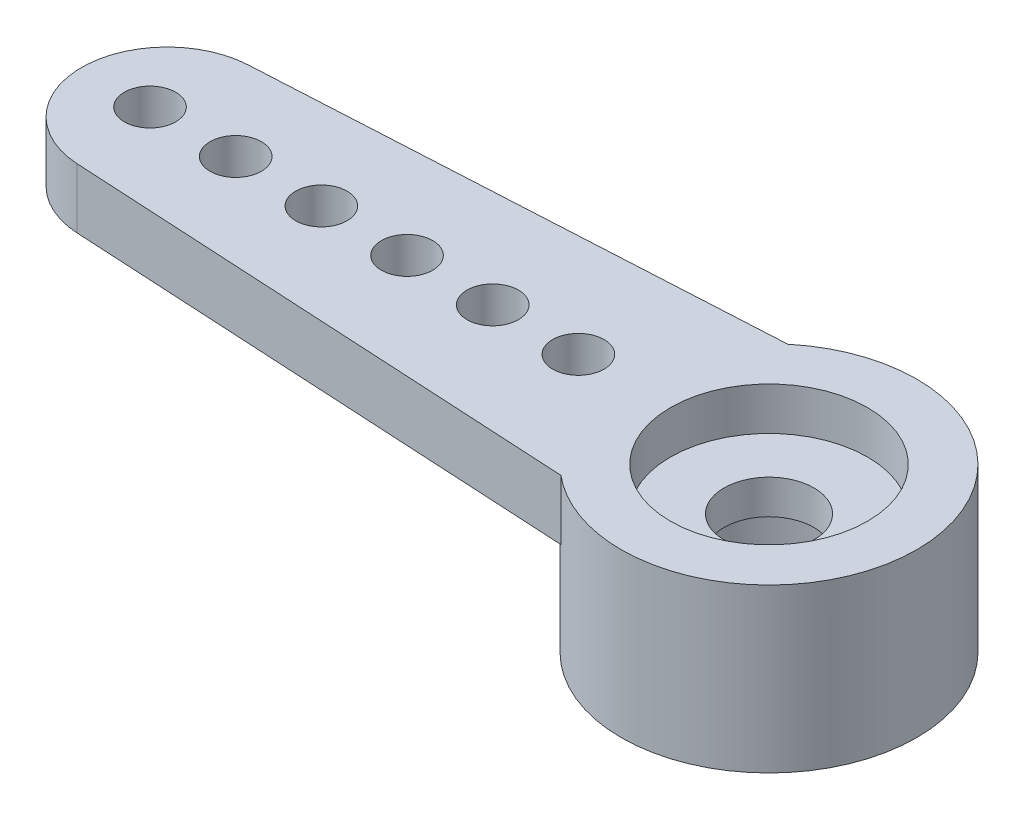
ISO-10303-21;
HEADER;
FILE_DESCRIPTION(('STEP AP214'),'2;1');
FILE_NAME('part.step','',(''),(''),'','','');
FILE_SCHEMA(('AUTOMOTIVE_DESIGN { 1 0 10303 214 1 1 1 1 }'));
ENDSEC;
DATA;
#1=APPLICATION_CONTEXT('core data for automotive mechanical design processes');
#2=APPLICATION_PROTOCOL_DEFINITION('international standard','automotive_design',2000,#1);
#3=PRODUCT_CONTEXT('',#1,'mechanical');
#4=PRODUCT('Part','Part','',(#3));
#5=PRODUCT_RELATED_PRODUCT_CATEGORY('part','',(#4));
#6=PRODUCT_DEFINITION_FORMATION('','',#4);
#7=PRODUCT_DEFINITION_CONTEXT('part definition',#1,'design');
#8=PRODUCT_DEFINITION('design','',#6,#7);
#9=PRODUCT_DEFINITION_SHAPE('','',#8);
#10=(LENGTH_UNIT() NAMED_UNIT(*) SI_UNIT(.MILLI.,.METRE.));
#11=(NAMED_UNIT(*) PLANE_ANGLE_UNIT() SI_UNIT($,.RADIAN.));
#12=(NAMED_UNIT(*) SI_UNIT($,.STERADIAN.) SOLID_ANGLE_UNIT());
#13=UNCERTAINTY_MEASURE_WITH_UNIT(LENGTH_MEASURE(1.E-05),#10,'distance_accuracy_value','');
#14=(GEOMETRIC_REPRESENTATION_CONTEXT(3) GLOBAL_UNCERTAINTY_ASSIGNED_CONTEXT((#13)) GLOBAL_UNIT_ASSIGNED_CONTEXT((#10,
#11,#12)) REPRESENTATION_CONTEXT('',''));
#15=CARTESIAN_POINT('',(0.,0.,0.));
#16=DIRECTION('',(0.,0.,1.));
#17=DIRECTION('',(1.,0.,0.));
#18=AXIS2_PLACEMENT_3D('',#15,#16,#17);
#19=CARTESIAN_POINT('',(0.,-1.4,0.));
#20=DIRECTION('',(0.,1.,0.));
#21=DIRECTION('',(0.,0.,1.));
#22=AXIS2_PLACEMENT_3D('',#19,#20,#21);
#23=PLANE('',#22);
#24=CARTESIAN_POINT('',(-12.45,-1.4,0.));
#25=DIRECTION('',(0.,1.,0.));
#26=DIRECTION('',(0.,0.,1.));
#27=AXIS2_PLACEMENT_3D('',#24,#25,#26);
#28=CIRCLE('',#27,0.600000000000014);
#29=CARTESIAN_POINT('',(-12.45,-1.4,0.600000000000014));
#30=VERTEX_POINT('',#29);
#31=EDGE_CURVE('E256',#30,#30,#28,.T.);
#32=ORIENTED_EDGE('',*,*,#31,.T.);
#33=EDGE_LOOP('',(#32));
#34=FACE_BOUND('',#33,.T.);
#35=CARTESIAN_POINT('',(-14.45,-1.4,0.));
#36=DIRECTION('',(0.,1.,0.));
#37=DIRECTION('',(0.,0.,1.));
#38=AXIS2_PLACEMENT_3D('',#35,#36,#37);
#39=CIRCLE('',#38,0.600000000000014);
#40=CARTESIAN_POINT('',(-14.45,-1.4,0.600000000000014));
#41=VERTEX_POINT('',#40);
#42=EDGE_CURVE('E101',#41,#41,#39,.T.);
#43=ORIENTED_EDGE('',*,*,#42,.T.);
#44=EDGE_LOOP('',(#43));
#45=FACE_BOUND('',#44,.T.);
#46=CARTESIAN_POINT('',(0.,-1.4,0.));
#47=DIRECTION('',(0.,-1.,0.));
#48=DIRECTION('',(0.,0.,-1.));
#49=AXIS2_PLACEMENT_3D('',#46,#47,#48);
#50=CIRCLE('',#49,3.45);
#51=CARTESIAN_POINT('',(-2.20907220343745,-1.4,2.65));
#52=VERTEX_POINT('',#51);
#53=CARTESIAN_POINT('',(-2.20907220343745,-1.4,-2.65));
#54=VERTEX_POINT('',#53);
#55=EDGE_CURVE('E88',#52,#54,#50,.T.);
#56=ORIENTED_EDGE('',*,*,#55,.F.);
#57=DIRECTION('',(0.998510440144325,0.,0.0545609835210727));
#58=VECTOR('',#57,1.);
#59=CARTESIAN_POINT('',(-2.20907220343745,-1.4,2.65));
#60=LINE('',#59,#58);
#61=CARTESIAN_POINT('',(-14.1591219670421,-1.4,1.99702088028865));
#62=VERTEX_POINT('',#61);
#63=EDGE_CURVE('E96',#62,#52,#60,.T.);
#64=ORIENTED_EDGE('',*,*,#63,.F.);
#65=CARTESIAN_POINT('',(-14.05,-1.4,0.));
#66=DIRECTION('',(0.,1.,0.));
#67=DIRECTION('',(0.,0.,1.));
#68=AXIS2_PLACEMENT_3D('',#65,#66,#67);
#69=CIRCLE('',#68,2.);
#70=CARTESIAN_POINT('',(-14.1591219670421,-1.4,-1.99702088028865));
#71=VERTEX_POINT('',#70);
#72=EDGE_CURVE('E114',#71,#62,#69,.T.);
#73=ORIENTED_EDGE('',*,*,#72,.F.);
#74=DIRECTION('',(-0.998510440144325,0.,0.0545609835210729));
#75=VECTOR('',#74,1.);
#76=CARTESIAN_POINT('',(-14.1591219670421,-1.4,-1.99702088028865));
#77=LINE('',#76,#75);
#78=EDGE_CURVE('E98',#54,#71,#77,.T.);
#79=ORIENTED_EDGE('',*,*,#78,.F.);
#80=EDGE_LOOP('',(#56,#64,#73,#79));
#81=FACE_BOUND('',#80,.T.);
#82=CARTESIAN_POINT('',(-10.45,-1.4,0.));
#83=DIRECTION('',(0.,1.,0.));
#84=DIRECTION('',(0.,0.,1.));
#85=AXIS2_PLACEMENT_3D('',#82,#83,#84);
#86=CIRCLE('',#85,0.600000000000014);
#87=CARTESIAN_POINT('',(-10.45,-1.4,0.600000000000014));
#88=VERTEX_POINT('',#87);
#89=EDGE_CURVE('E142',#88,#88,#86,.T.);
#90=ORIENTED_EDGE('',*,*,#89,.T.);
#91=EDGE_LOOP('',(#90));
#92=FACE_BOUND('',#91,.T.);
#93=CARTESIAN_POINT('',(-8.45,-1.4,0.));
#94=DIRECTION('',(0.,1.,0.));
#95=DIRECTION('',(0.,0.,1.));
#96=AXIS2_PLACEMENT_3D('',#93,#94,#95);
#97=CIRCLE('',#96,0.600000000000014);
#98=CARTESIAN_POINT('',(-8.45,-1.4,0.600000000000014));
#99=VERTEX_POINT('',#98);
#100=EDGE_CURVE('E150',#99,#99,#97,.T.);
#101=ORIENTED_EDGE('',*,*,#100,.T.);
#102=EDGE_LOOP('',(#101));
#103=FACE_BOUND('',#102,.T.);
#104=CARTESIAN_POINT('',(-6.45,-1.4,0.));
#105=DIRECTION('',(0.,1.,0.));
#106=DIRECTION('',(0.,0.,1.));
#107=AXIS2_PLACEMENT_3D('',#104,#105,#106);
#108=CIRCLE('',#107,0.600000000000014);
#109=CARTESIAN_POINT('',(-6.45,-1.4,0.600000000000014));
#110=VERTEX_POINT('',#109);
#111=EDGE_CURVE('E158',#110,#110,#108,.T.);
#112=ORIENTED_EDGE('',*,*,#111,.T.);
#113=EDGE_LOOP('',(#112));
#114=FACE_BOUND('',#113,.T.);
#115=CARTESIAN_POINT('',(-4.45,-1.4,0.));
#116=DIRECTION('',(0.,1.,0.));
#117=DIRECTION('',(0.,0.,1.));
#118=AXIS2_PLACEMENT_3D('',#115,#116,#117);
#119=CIRCLE('',#118,0.600000000000014);
#120=CARTESIAN_POINT('',(-4.45,-1.4,0.600000000000014));
#121=VERTEX_POINT('',#120);
#122=EDGE_CURVE('E12',#121,#121,#119,.T.);
#123=ORIENTED_EDGE('',*,*,#122,.T.);
#124=EDGE_LOOP('',(#123));
#125=FACE_BOUND('',#124,.T.);
#126=ADVANCED_FACE('F45',(#34,#45,#81,#92,#103,#114,#125),#23,.F.);
#127=CARTESIAN_POINT('',(0.,-1.4,0.));
#128=DIRECTION('',(0.,1.,0.));
#129=DIRECTION('',(0.,0.,1.));
#130=AXIS2_PLACEMENT_3D('',#127,#128,#129);
#131=CYLINDRICAL_SURFACE('',#130,3.45);
#132=CARTESIAN_POINT('',(0.,0.,0.));
#133=DIRECTION('',(0.,1.,0.));
#134=DIRECTION('',(0.,0.,1.));
#135=AXIS2_PLACEMENT_3D('',#132,#133,#134);
#136=CIRCLE('',#135,3.45);
#137=CARTESIAN_POINT('',(-2.20907220343745,0.,2.65));
#138=VERTEX_POINT('',#137);
#139=CARTESIAN_POINT('',(-2.20907220343745,0.,-2.65));
#140=VERTEX_POINT('',#139);
#141=EDGE_CURVE('E106',#138,#140,#136,.T.);
#142=ORIENTED_EDGE('',*,*,#141,.F.);
#143=DIRECTION('',(0.,1.,0.));
#144=VECTOR('',#143,1.);
#145=CARTESIAN_POINT('',(-2.20907220343745,-1.4,2.65));
#146=LINE('',#145,#144);
#147=EDGE_CURVE('E83',#52,#138,#146,.T.);
#148=ORIENTED_EDGE('',*,*,#147,.F.);
#149=ORIENTED_EDGE('',*,*,#55,.T.);
#150=DIRECTION('',(0.,1.,0.));
#151=VECTOR('',#150,1.);
#152=CARTESIAN_POINT('',(-2.20907220343745,-1.4,-2.65));
#153=LINE('',#152,#151);
#154=EDGE_CURVE('E113',#54,#140,#153,.T.);
#155=ORIENTED_EDGE('',*,*,#154,.T.);
#156=EDGE_LOOP('',(#142,#148,#149,#155));
#157=FACE_BOUND('',#156,.T.);
#158=CARTESIAN_POINT('',(0.,-3.8,0.));
#159=DIRECTION('',(0.,1.,0.));
#160=DIRECTION('',(0.,0.,1.));
#161=AXIS2_PLACEMENT_3D('',#158,#159,#160);
#162=CIRCLE('',#161,3.45);
#163=CARTESIAN_POINT('',(0.,-3.8,3.45));
#164=VERTEX_POINT('',#163);
#165=EDGE_CURVE('E100',#164,#164,#162,.T.);
#166=ORIENTED_EDGE('',*,*,#165,.T.);
#167=EDGE_LOOP('',(#166));
#168=FACE_BOUND('',#167,.T.);
#169=ADVANCED_FACE('F103',(#157,#168),#131,.T.);
#170=CARTESIAN_POINT('',(-2.20907220343745,-1.4,2.65));
#171=DIRECTION('',(-0.0545609835210727,0.,0.998510440144325));
#172=DIRECTION('',(0.998510440144325,0.,0.0545609835210727));
#173=AXIS2_PLACEMENT_3D('',#170,#171,#172);
#174=PLANE('',#173);
#175=DIRECTION('',(0.998510440144325,0.,0.0545609835210727));
#176=VECTOR('',#175,1.);
#177=CARTESIAN_POINT('',(-2.20907220343745,0.,2.65));
#178=LINE('',#177,#176);
#179=CARTESIAN_POINT('',(-14.1591219670421,0.,1.99702088028865));
#180=VERTEX_POINT('',#179);
#181=EDGE_CURVE('E132',#180,#138,#178,.T.);
#182=ORIENTED_EDGE('',*,*,#181,.F.);
#183=DIRECTION('',(0.,1.,0.));
#184=VECTOR('',#183,1.);
#185=CARTESIAN_POINT('',(-14.1591219670421,-1.4,1.99702088028865));
#186=LINE('',#185,#184);
#187=EDGE_CURVE('E64',#62,#180,#186,.T.);
#188=ORIENTED_EDGE('',*,*,#187,.F.);
#189=ORIENTED_EDGE('',*,*,#63,.T.);
#190=ORIENTED_EDGE('',*,*,#147,.T.);
#191=EDGE_LOOP('',(#182,#188,#189,#190));
#192=FACE_BOUND('',#191,.T.);
#193=ADVANCED_FACE('F111',(#192),#174,.T.);
#194=CARTESIAN_POINT('',(-14.05,-1.4,0.));
#195=DIRECTION('',(0.,1.,0.));
#196=DIRECTION('',(0.,0.,1.));
#197=AXIS2_PLACEMENT_3D('',#194,#195,#196);
#198=CYLINDRICAL_SURFACE('',#197,2.);
#199=CARTESIAN_POINT('',(-14.05,0.,0.));
#200=DIRECTION('',(0.,1.,0.));
#201=DIRECTION('',(0.,0.,1.));
#202=AXIS2_PLACEMENT_3D('',#199,#200,#201);
#203=CIRCLE('',#202,2.);
#204=CARTESIAN_POINT('',(-14.1591219670421,0.,-1.99702088028865));
#205=VERTEX_POINT('',#204);
#206=EDGE_CURVE('E129',#205,#180,#203,.T.);
#207=ORIENTED_EDGE('',*,*,#206,.F.);
#208=DIRECTION('',(0.,1.,0.));
#209=VECTOR('',#208,1.);
#210=CARTESIAN_POINT('',(-14.1591219670421,-1.4,-1.99702088028865));
#211=LINE('',#210,#209);
#212=EDGE_CURVE('E118',#71,#205,#211,.T.);
#213=ORIENTED_EDGE('',*,*,#212,.F.);
#214=ORIENTED_EDGE('',*,*,#72,.T.);
#215=ORIENTED_EDGE('',*,*,#187,.T.);
#216=EDGE_LOOP('',(#207,#213,#214,#215));
#217=FACE_BOUND('',#216,.T.);
#218=ADVANCED_FACE('F183',(#217),#198,.T.);
#219=CARTESIAN_POINT('',(-14.1591219670421,-1.4,-1.99702088028865));
#220=DIRECTION('',(-0.0545609835210729,0.,-0.998510440144325));
#221=DIRECTION('',(-0.998510440144325,0.,0.0545609835210729));
#222=AXIS2_PLACEMENT_3D('',#219,#220,#221);
#223=PLANE('',#222);
#224=DIRECTION('',(-0.998510440144325,0.,0.0545609835210729));
#225=VECTOR('',#224,1.);
#226=CARTESIAN_POINT('',(-14.1591219670421,0.,-1.99702088028865));
#227=LINE('',#226,#225);
#228=EDGE_CURVE('E125',#140,#205,#227,.T.);
#229=ORIENTED_EDGE('',*,*,#228,.F.);
#230=ORIENTED_EDGE('',*,*,#154,.F.);
#231=ORIENTED_EDGE('',*,*,#78,.T.);
#232=ORIENTED_EDGE('',*,*,#212,.T.);
#233=EDGE_LOOP('',(#229,#230,#231,#232));
#234=FACE_BOUND('',#233,.T.);
#235=ADVANCED_FACE('F171',(#234),#223,.T.);
#236=CARTESIAN_POINT('',(0.,0.,0.));
#237=DIRECTION('',(0.,1.,0.));
#238=DIRECTION('',(0.,0.,1.));
#239=AXIS2_PLACEMENT_3D('',#236,#237,#238);
#240=PLANE('',#239);
#241=CARTESIAN_POINT('',(0.,0.,0.));
#242=DIRECTION('',(0.,1.,0.));
#243=DIRECTION('',(0.,0.,1.));
#244=AXIS2_PLACEMENT_3D('',#241,#242,#243);
#245=CIRCLE('',#244,2.30000000000001);
#246=CARTESIAN_POINT('',(0.,0.,2.30000000000001));
#247=VERTEX_POINT('',#246);
#248=EDGE_CURVE('E233',#247,#247,#245,.T.);
#249=ORIENTED_EDGE('',*,*,#248,.F.);
#250=EDGE_LOOP('',(#249));
#251=FACE_BOUND('',#250,.T.);
#252=CARTESIAN_POINT('',(-12.45,0.,0.));
#253=DIRECTION('',(0.,1.,0.));
#254=DIRECTION('',(0.,0.,1.));
#255=AXIS2_PLACEMENT_3D('',#252,#253,#254);
#256=CIRCLE('',#255,0.600000000000014);
#257=CARTESIAN_POINT('',(-12.45,0.,0.600000000000014));
#258=VERTEX_POINT('',#257);
#259=EDGE_CURVE('E252',#258,#258,#256,.T.);
#260=ORIENTED_EDGE('',*,*,#259,.F.);
#261=EDGE_LOOP('',(#260));
#262=FACE_BOUND('',#261,.T.);
#263=CARTESIAN_POINT('',(-14.45,0.,0.));
#264=DIRECTION('',(0.,1.,0.));
#265=DIRECTION('',(0.,0.,1.));
#266=AXIS2_PLACEMENT_3D('',#263,#264,#265);
#267=CIRCLE('',#266,0.600000000000014);
#268=CARTESIAN_POINT('',(-14.45,0.,0.600000000000014));
#269=VERTEX_POINT('',#268);
#270=EDGE_CURVE('E259',#269,#269,#267,.T.);
#271=ORIENTED_EDGE('',*,*,#270,.F.);
#272=EDGE_LOOP('',(#271));
#273=FACE_BOUND('',#272,.T.);
#274=ORIENTED_EDGE('',*,*,#141,.T.);
#275=ORIENTED_EDGE('',*,*,#228,.T.);
#276=ORIENTED_EDGE('',*,*,#206,.T.);
#277=ORIENTED_EDGE('',*,*,#181,.T.);
#278=EDGE_LOOP('',(#274,#275,#276,#277));
#279=FACE_BOUND('',#278,.T.);
#280=CARTESIAN_POINT('',(-10.45,0.,0.));
#281=DIRECTION('',(0.,1.,0.));
#282=DIRECTION('',(0.,0.,1.));
#283=AXIS2_PLACEMENT_3D('',#280,#281,#282);
#284=CIRCLE('',#283,0.600000000000014);
#285=CARTESIAN_POINT('',(-10.45,0.,0.600000000000014));
#286=VERTEX_POINT('',#285);
#287=EDGE_CURVE('E109',#286,#286,#284,.T.);
#288=ORIENTED_EDGE('',*,*,#287,.F.);
#289=EDGE_LOOP('',(#288));
#290=FACE_BOUND('',#289,.T.);
#291=CARTESIAN_POINT('',(-8.45,0.,0.));
#292=DIRECTION('',(0.,1.,0.));
#293=DIRECTION('',(0.,0.,1.));
#294=AXIS2_PLACEMENT_3D('',#291,#292,#293);
#295=CIRCLE('',#294,0.600000000000014);
#296=CARTESIAN_POINT('',(-8.45,0.,0.600000000000014));
#297=VERTEX_POINT('',#296);
#298=EDGE_CURVE('E146',#297,#297,#295,.T.);
#299=ORIENTED_EDGE('',*,*,#298,.F.);
#300=EDGE_LOOP('',(#299));
#301=FACE_BOUND('',#300,.T.);
#302=CARTESIAN_POINT('',(-6.45,0.,0.));
#303=DIRECTION('',(0.,1.,0.));
#304=DIRECTION('',(0.,0.,1.));
#305=AXIS2_PLACEMENT_3D('',#302,#303,#304);
#306=CIRCLE('',#305,0.600000000000014);
#307=CARTESIAN_POINT('',(-6.45,0.,0.600000000000014));
#308=VERTEX_POINT('',#307);
#309=EDGE_CURVE('E154',#308,#308,#306,.T.);
#310=ORIENTED_EDGE('',*,*,#309,.F.);
#311=EDGE_LOOP('',(#310));
#312=FACE_BOUND('',#311,.T.);
#313=CARTESIAN_POINT('',(-4.45,0.,0.));
#314=DIRECTION('',(0.,1.,0.));
#315=DIRECTION('',(0.,0.,1.));
#316=AXIS2_PLACEMENT_3D('',#313,#314,#315);
#317=CIRCLE('',#316,0.600000000000014);
#318=CARTESIAN_POINT('',(-4.45,0.,0.600000000000014));
#319=VERTEX_POINT('',#318);
#320=EDGE_CURVE('E56',#319,#319,#317,.T.);
#321=ORIENTED_EDGE('',*,*,#320,.F.);
#322=EDGE_LOOP('',(#321));
#323=FACE_BOUND('',#322,.T.);
#324=ADVANCED_FACE('F168',(#251,#262,#273,#279,#290,#301,#312,#323),#240,.T.);
#325=CARTESIAN_POINT('',(0.,-3.8,0.));
#326=DIRECTION('',(0.,1.,0.));
#327=DIRECTION('',(0.,0.,1.));
#328=AXIS2_PLACEMENT_3D('',#325,#326,#327);
#329=PLANE('',#328);
#330=CARTESIAN_POINT('',(0.,-3.8,0.));
#331=DIRECTION('',(0.,-1.,0.));
#332=DIRECTION('',(0.,0.,-1.));
#333=AXIS2_PLACEMENT_3D('',#330,#331,#332);
#334=CIRCLE('',#333,2.47500000000001);
#335=CARTESIAN_POINT('',(0.,-3.8,-2.47500000000001));
#336=VERTEX_POINT('',#335);
#337=EDGE_CURVE('E244',#336,#336,#334,.T.);
#338=ORIENTED_EDGE('',*,*,#337,.F.);
#339=EDGE_LOOP('',(#338));
#340=FACE_BOUND('',#339,.T.);
#341=ORIENTED_EDGE('',*,*,#165,.F.);
#342=EDGE_LOOP('',(#341));
#343=FACE_BOUND('',#342,.T.);
#344=ADVANCED_FACE('F170',(#340,#343),#329,.F.);
#345=CARTESIAN_POINT('',(-14.45,0.,0.));
#346=DIRECTION('',(0.,1.,0.));
#347=DIRECTION('',(0.,0.,1.));
#348=AXIS2_PLACEMENT_3D('',#345,#346,#347);
#349=CYLINDRICAL_SURFACE('',#348,0.600000000000014);
#350=ORIENTED_EDGE('',*,*,#270,.T.);
#351=EDGE_LOOP('',(#350));
#352=FACE_BOUND('',#351,.T.);
#353=ORIENTED_EDGE('',*,*,#42,.F.);
#354=EDGE_LOOP('',(#353));
#355=FACE_BOUND('',#354,.T.);
#356=ADVANCED_FACE('F179',(#352,#355),#349,.F.);
#357=CARTESIAN_POINT('',(-12.45,0.,0.));
#358=DIRECTION('',(0.,1.,0.));
#359=DIRECTION('',(0.,0.,1.));
#360=AXIS2_PLACEMENT_3D('',#357,#358,#359);
#361=CYLINDRICAL_SURFACE('',#360,0.600000000000014);
#362=ORIENTED_EDGE('',*,*,#259,.T.);
#363=EDGE_LOOP('',(#362));
#364=FACE_BOUND('',#363,.T.);
#365=ORIENTED_EDGE('',*,*,#31,.F.);
#366=EDGE_LOOP('',(#365));
#367=FACE_BOUND('',#366,.T.);
#368=ADVANCED_FACE('F202',(#364,#367),#361,.F.);
#369=CARTESIAN_POINT('',(-10.45,0.,0.));
#370=DIRECTION('',(0.,1.,0.));
#371=DIRECTION('',(0.,0.,1.));
#372=AXIS2_PLACEMENT_3D('',#369,#370,#371);
#373=CYLINDRICAL_SURFACE('',#372,0.600000000000014);
#374=ORIENTED_EDGE('',*,*,#287,.T.);
#375=EDGE_LOOP('',(#374));
#376=FACE_BOUND('',#375,.T.);
#377=ORIENTED_EDGE('',*,*,#89,.F.);
#378=EDGE_LOOP('',(#377));
#379=FACE_BOUND('',#378,.T.);
#380=ADVANCED_FACE('F205',(#376,#379),#373,.F.);
#381=CARTESIAN_POINT('',(-8.45,0.,0.));
#382=DIRECTION('',(0.,1.,0.));
#383=DIRECTION('',(0.,0.,1.));
#384=AXIS2_PLACEMENT_3D('',#381,#382,#383);
#385=CYLINDRICAL_SURFACE('',#384,0.600000000000014);
#386=ORIENTED_EDGE('',*,*,#298,.T.);
#387=EDGE_LOOP('',(#386));
#388=FACE_BOUND('',#387,.T.);
#389=ORIENTED_EDGE('',*,*,#100,.F.);
#390=EDGE_LOOP('',(#389));
#391=FACE_BOUND('',#390,.T.);
#392=ADVANCED_FACE('F282',(#388,#391),#385,.F.);
#393=CARTESIAN_POINT('',(-6.45,0.,0.));
#394=DIRECTION('',(0.,1.,0.));
#395=DIRECTION('',(0.,0.,1.));
#396=AXIS2_PLACEMENT_3D('',#393,#394,#395);
#397=CYLINDRICAL_SURFACE('',#396,0.600000000000014);
#398=ORIENTED_EDGE('',*,*,#309,.T.);
#399=EDGE_LOOP('',(#398));
#400=FACE_BOUND('',#399,.T.);
#401=ORIENTED_EDGE('',*,*,#111,.F.);
#402=EDGE_LOOP('',(#401));
#403=FACE_BOUND('',#402,.T.);
#404=ADVANCED_FACE('F285',(#400,#403),#397,.F.);
#405=CARTESIAN_POINT('',(-4.45,0.,0.));
#406=DIRECTION('',(0.,1.,0.));
#407=DIRECTION('',(0.,0.,1.));
#408=AXIS2_PLACEMENT_3D('',#405,#406,#407);
#409=CYLINDRICAL_SURFACE('',#408,0.600000000000014);
#410=ORIENTED_EDGE('',*,*,#320,.T.);
#411=EDGE_LOOP('',(#410));
#412=FACE_BOUND('',#411,.T.);
#413=ORIENTED_EDGE('',*,*,#122,.F.);
#414=EDGE_LOOP('',(#413));
#415=FACE_BOUND('',#414,.T.);
#416=ADVANCED_FACE('F47',(#412,#415),#409,.F.);
#417=CARTESIAN_POINT('',(0.,-1.8,0.));
#418=DIRECTION('',(0.,1.,0.));
#419=DIRECTION('',(0.,0.,1.));
#420=AXIS2_PLACEMENT_3D('',#417,#418,#419);
#421=PLANE('',#420);
#422=CARTESIAN_POINT('',(0.,-1.8,0.));
#423=DIRECTION('',(0.,1.,0.));
#424=DIRECTION('',(0.,0.,1.));
#425=AXIS2_PLACEMENT_3D('',#422,#423,#424);
#426=CIRCLE('',#425,1.05000000000001);
#427=CARTESIAN_POINT('',(0.,-1.8,1.05000000000001));
#428=VERTEX_POINT('',#427);
#429=EDGE_CURVE('E231',#428,#428,#426,.T.);
#430=ORIENTED_EDGE('',*,*,#429,.T.);
#431=EDGE_LOOP('',(#430));
#432=FACE_BOUND('',#431,.T.);
#433=CARTESIAN_POINT('',(0.,-1.8,0.));
#434=DIRECTION('',(0.,-1.,0.));
#435=DIRECTION('',(0.,0.,-1.));
#436=AXIS2_PLACEMENT_3D('',#433,#434,#435);
#437=CIRCLE('',#436,2.47500000000001);
#438=CARTESIAN_POINT('',(0.,-1.8,-2.47500000000001));
#439=VERTEX_POINT('',#438);
#440=EDGE_CURVE('E248',#439,#439,#437,.T.);
#441=ORIENTED_EDGE('',*,*,#440,.T.);
#442=EDGE_LOOP('',(#441));
#443=FACE_BOUND('',#442,.T.);
#444=ADVANCED_FACE('F207',(#432,#443),#421,.F.);
#445=CARTESIAN_POINT('',(0.,-3.8,0.));
#446=DIRECTION('',(0.,-1.,0.));
#447=DIRECTION('',(0.,0.,-1.));
#448=AXIS2_PLACEMENT_3D('',#445,#446,#447);
#449=CYLINDRICAL_SURFACE('',#448,2.47500000000001);
#450=ORIENTED_EDGE('',*,*,#440,.F.);
#451=EDGE_LOOP('',(#450));
#452=FACE_BOUND('',#451,.T.);
#453=ORIENTED_EDGE('',*,*,#337,.T.);
#454=EDGE_LOOP('',(#453));
#455=FACE_BOUND('',#454,.T.);
#456=ADVANCED_FACE('F210',(#452,#455),#449,.F.);
#457=CARTESIAN_POINT('',(0.,-1.,0.));
#458=DIRECTION('',(0.,-1.,0.));
#459=DIRECTION('',(0.,0.,-1.));
#460=AXIS2_PLACEMENT_3D('',#457,#458,#459);
#461=PLANE('',#460);
#462=CARTESIAN_POINT('',(0.,-1.,0.));
#463=DIRECTION('',(0.,-1.,0.));
#464=DIRECTION('',(0.,0.,-1.));
#465=AXIS2_PLACEMENT_3D('',#462,#463,#464);
#466=CIRCLE('',#465,1.05000000000001);
#467=CARTESIAN_POINT('',(0.,-1.,-1.05000000000001));
#468=VERTEX_POINT('',#467);
#469=EDGE_CURVE('E49',#468,#468,#466,.T.);
#470=ORIENTED_EDGE('',*,*,#469,.T.);
#471=EDGE_LOOP('',(#470));
#472=FACE_BOUND('',#471,.T.);
#473=CARTESIAN_POINT('',(0.,-1.,0.));
#474=DIRECTION('',(0.,1.,0.));
#475=DIRECTION('',(0.,0.,1.));
#476=AXIS2_PLACEMENT_3D('',#473,#474,#475);
#477=CIRCLE('',#476,2.30000000000001);
#478=CARTESIAN_POINT('',(0.,-1.,2.30000000000001));
#479=VERTEX_POINT('',#478);
#480=EDGE_CURVE('E238',#479,#479,#477,.T.);
#481=ORIENTED_EDGE('',*,*,#480,.T.);
#482=EDGE_LOOP('',(#481));
#483=FACE_BOUND('',#482,.T.);
#484=ADVANCED_FACE('F213',(#472,#483),#461,.F.);
#485=CARTESIAN_POINT('',(0.,0.,0.));
#486=DIRECTION('',(0.,1.,0.));
#487=DIRECTION('',(0.,0.,1.));
#488=AXIS2_PLACEMENT_3D('',#485,#486,#487);
#489=CYLINDRICAL_SURFACE('',#488,2.30000000000001);
#490=ORIENTED_EDGE('',*,*,#480,.F.);
#491=EDGE_LOOP('',(#490));
#492=FACE_BOUND('',#491,.T.);
#493=ORIENTED_EDGE('',*,*,#248,.T.);
#494=EDGE_LOOP('',(#493));
#495=FACE_BOUND('',#494,.T.);
#496=ADVANCED_FACE('F217',(#492,#495),#489,.F.);
#497=CARTESIAN_POINT('',(0.,0.,0.));
#498=DIRECTION('',(0.,1.,0.));
#499=DIRECTION('',(0.,0.,1.));
#500=AXIS2_PLACEMENT_3D('',#497,#498,#499);
#501=CYLINDRICAL_SURFACE('',#500,1.05000000000001);
#502=ORIENTED_EDGE('',*,*,#469,.F.);
#503=EDGE_LOOP('',(#502));
#504=FACE_BOUND('',#503,.T.);
#505=ORIENTED_EDGE('',*,*,#429,.F.);
#506=EDGE_LOOP('',(#505));
#507=FACE_BOUND('',#506,.T.);
#508=ADVANCED_FACE('F220',(#504,#507),#501,.F.);
#509=CLOSED_SHELL('',(#126,#169,#193,#218,#235,#324,#344,#356,#368,#380,#392,#404,#416,#444,
#456,#484,#496,#508));
#510=MANIFOLD_SOLID_BREP('B2',#509);
#511=ADVANCED_BREP_SHAPE_REPRESENTATION('',(#18,#510),#14);
#512=SHAPE_DEFINITION_REPRESENTATION(#9,#511);
ENDSEC;
END-ISO-10303-21;
